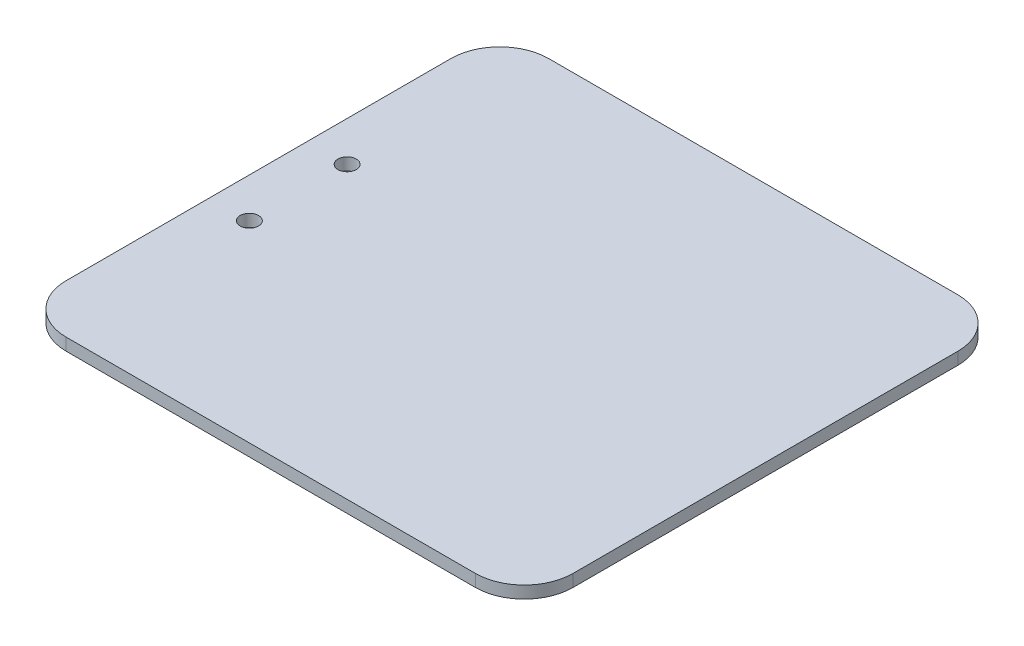
ISO-10303-21;
HEADER;
FILE_DESCRIPTION(('STEP AP214'),'2;1');
FILE_NAME('part.step','',(''),(''),'','','');
FILE_SCHEMA(('AUTOMOTIVE_DESIGN { 1 0 10303 214 1 1 1 1 }'));
ENDSEC;
DATA;
#1=APPLICATION_CONTEXT('core data for automotive mechanical design processes');
#2=APPLICATION_PROTOCOL_DEFINITION('international standard','automotive_design',2000,#1);
#3=PRODUCT_CONTEXT('',#1,'mechanical');
#4=PRODUCT('Part','Part','',(#3));
#5=PRODUCT_RELATED_PRODUCT_CATEGORY('part','',(#4));
#6=PRODUCT_DEFINITION_FORMATION('','',#4);
#7=PRODUCT_DEFINITION_CONTEXT('part definition',#1,'design');
#8=PRODUCT_DEFINITION('design','',#6,#7);
#9=PRODUCT_DEFINITION_SHAPE('','',#8);
#10=(LENGTH_UNIT() NAMED_UNIT(*) SI_UNIT(.MILLI.,.METRE.));
#11=(NAMED_UNIT(*) PLANE_ANGLE_UNIT() SI_UNIT($,.RADIAN.));
#12=(NAMED_UNIT(*) SI_UNIT($,.STERADIAN.) SOLID_ANGLE_UNIT());
#13=UNCERTAINTY_MEASURE_WITH_UNIT(LENGTH_MEASURE(1.E-05),#10,'distance_accuracy_value','');
#14=(GEOMETRIC_REPRESENTATION_CONTEXT(3) GLOBAL_UNCERTAINTY_ASSIGNED_CONTEXT((#13)) GLOBAL_UNIT_ASSIGNED_CONTEXT((#10,
#11,#12)) REPRESENTATION_CONTEXT('',''));
#15=CARTESIAN_POINT('',(0.,0.,0.));
#16=DIRECTION('',(0.,0.,1.));
#17=DIRECTION('',(1.,0.,0.));
#18=AXIS2_PLACEMENT_3D('',#15,#16,#17);
#19=CARTESIAN_POINT('',(8.,2.,-8.));
#20=DIRECTION('',(0.,-1.,0.));
#21=DIRECTION('',(0.,0.,-1.));
#22=AXIS2_PLACEMENT_3D('',#19,#20,#21);
#23=PLANE('',#22);
#24=CARTESIAN_POINT('',(8.,2.,-8.));
#25=DIRECTION('',(0.,1.,0.));
#26=DIRECTION('',(0.,0.,-1.));
#27=AXIS2_PLACEMENT_3D('',#24,#25,#26);
#28=CIRCLE('',#27,8.);
#29=CARTESIAN_POINT('',(0.,2.,-8.00000000000006));
#30=VERTEX_POINT('',#29);
#31=CARTESIAN_POINT('',(8.00000000000006,2.,0.));
#32=VERTEX_POINT('',#31);
#33=EDGE_CURVE('E170',#30,#32,#28,.T.);
#34=ORIENTED_EDGE('',*,*,#33,.T.);
#35=DIRECTION('',(1.,0.,0.));
#36=VECTOR('',#35,1.);
#37=CARTESIAN_POINT('',(8.00000000000006,2.,0.));
#38=LINE('',#37,#36);
#39=CARTESIAN_POINT('',(74.9999999999999,2.,0.));
#40=VERTEX_POINT('',#39);
#41=EDGE_CURVE('E106',#32,#40,#38,.T.);
#42=ORIENTED_EDGE('',*,*,#41,.T.);
#43=CARTESIAN_POINT('',(75.,2.,-8.));
#44=DIRECTION('',(0.,1.,0.));
#45=DIRECTION('',(0.,0.,1.));
#46=AXIS2_PLACEMENT_3D('',#43,#44,#45);
#47=CIRCLE('',#46,8.);
#48=CARTESIAN_POINT('',(83.,2.,-8.00000000000005));
#49=VERTEX_POINT('',#48);
#50=EDGE_CURVE('E191',#40,#49,#47,.T.);
#51=ORIENTED_EDGE('',*,*,#50,.T.);
#52=DIRECTION('',(0.,0.,-1.));
#53=VECTOR('',#52,1.);
#54=CARTESIAN_POINT('',(83.,2.,-8.00000000000006));
#55=LINE('',#54,#53);
#56=CARTESIAN_POINT('',(83.,2.,-71.));
#57=VERTEX_POINT('',#56);
#58=EDGE_CURVE('E205',#49,#57,#55,.T.);
#59=ORIENTED_EDGE('',*,*,#58,.T.);
#60=CARTESIAN_POINT('',(75.,2.,-71.));
#61=DIRECTION('',(0.,1.,0.));
#62=DIRECTION('',(0.,0.,-1.));
#63=AXIS2_PLACEMENT_3D('',#60,#61,#62);
#64=CIRCLE('',#63,7.99999999999999);
#65=CARTESIAN_POINT('',(74.9999999999999,2.,-79.));
#66=VERTEX_POINT('',#65);
#67=EDGE_CURVE('E125',#57,#66,#64,.T.);
#68=ORIENTED_EDGE('',*,*,#67,.T.);
#69=DIRECTION('',(-1.,0.,0.));
#70=VECTOR('',#69,1.);
#71=CARTESIAN_POINT('',(8.00000000000006,2.,-79.));
#72=LINE('',#71,#70);
#73=CARTESIAN_POINT('',(8.00000000000006,2.,-79.));
#74=VERTEX_POINT('',#73);
#75=EDGE_CURVE('E119',#66,#74,#72,.T.);
#76=ORIENTED_EDGE('',*,*,#75,.T.);
#77=CARTESIAN_POINT('',(8.,2.,-71.));
#78=DIRECTION('',(0.,1.,0.));
#79=DIRECTION('',(0.,0.,-1.));
#80=AXIS2_PLACEMENT_3D('',#77,#78,#79);
#81=CIRCLE('',#80,8.);
#82=CARTESIAN_POINT('',(0.,2.,-71.));
#83=VERTEX_POINT('',#82);
#84=EDGE_CURVE('E123',#74,#83,#81,.T.);
#85=ORIENTED_EDGE('',*,*,#84,.T.);
#86=DIRECTION('',(0.,0.,1.));
#87=VECTOR('',#86,1.);
#88=CARTESIAN_POINT('',(0.,2.,-8.00000000000006));
#89=LINE('',#88,#87);
#90=EDGE_CURVE('E63',#83,#30,#89,.T.);
#91=ORIENTED_EDGE('',*,*,#90,.T.);
#92=EDGE_LOOP('',(#34,#42,#51,#59,#68,#76,#85,#91));
#93=FACE_BOUND('',#92,.T.);
#94=CARTESIAN_POINT('',(6.5,2.,-47.5));
#95=DIRECTION('',(0.,1.,0.));
#96=DIRECTION('',(0.,0.,1.));
#97=AXIS2_PLACEMENT_3D('',#94,#95,#96);
#98=CIRCLE('',#97,1.5);
#99=CARTESIAN_POINT('',(6.5,2.,-46.));
#100=VERTEX_POINT('',#99);
#101=EDGE_CURVE('E152',#100,#100,#98,.T.);
#102=ORIENTED_EDGE('',*,*,#101,.F.);
#103=EDGE_LOOP('',(#102));
#104=FACE_BOUND('',#103,.T.);
#105=CARTESIAN_POINT('',(6.5,2.,-31.5));
#106=DIRECTION('',(0.,1.,0.));
#107=DIRECTION('',(0.,0.,-1.));
#108=AXIS2_PLACEMENT_3D('',#105,#106,#107);
#109=CIRCLE('',#108,1.5);
#110=CARTESIAN_POINT('',(6.5,2.,-33.));
#111=VERTEX_POINT('',#110);
#112=EDGE_CURVE('E219',#111,#111,#109,.T.);
#113=ORIENTED_EDGE('',*,*,#112,.F.);
#114=EDGE_LOOP('',(#113));
#115=FACE_BOUND('',#114,.T.);
#116=ADVANCED_FACE('F45',(#93,#104,#115),#23,.F.);
#117=CARTESIAN_POINT('',(8.,0.,-8.));
#118=DIRECTION('',(0.,-1.,0.));
#119=DIRECTION('',(0.,0.,-1.));
#120=AXIS2_PLACEMENT_3D('',#117,#118,#119);
#121=PLANE('',#120);
#122=CARTESIAN_POINT('',(6.5,0.,-47.5));
#123=DIRECTION('',(0.,1.,0.));
#124=DIRECTION('',(0.,0.,1.));
#125=AXIS2_PLACEMENT_3D('',#122,#123,#124);
#126=CIRCLE('',#125,1.5);
#127=CARTESIAN_POINT('',(6.5,0.,-46.));
#128=VERTEX_POINT('',#127);
#129=EDGE_CURVE('E215',#128,#128,#126,.T.);
#130=ORIENTED_EDGE('',*,*,#129,.T.);
#131=EDGE_LOOP('',(#130));
#132=FACE_BOUND('',#131,.T.);
#133=CARTESIAN_POINT('',(8.,0.,-8.));
#134=DIRECTION('',(0.,1.,0.));
#135=DIRECTION('',(0.,0.,-1.));
#136=AXIS2_PLACEMENT_3D('',#133,#134,#135);
#137=CIRCLE('',#136,8.);
#138=CARTESIAN_POINT('',(0.,0.,-8.00000000000006));
#139=VERTEX_POINT('',#138);
#140=CARTESIAN_POINT('',(8.00000000000006,0.,0.));
#141=VERTEX_POINT('',#140);
#142=EDGE_CURVE('E147',#139,#141,#137,.T.);
#143=ORIENTED_EDGE('',*,*,#142,.F.);
#144=DIRECTION('',(0.,0.,1.));
#145=VECTOR('',#144,1.);
#146=CARTESIAN_POINT('',(0.,0.,-8.00000000000006));
#147=LINE('',#146,#145);
#148=CARTESIAN_POINT('',(0.,0.,-71.));
#149=VERTEX_POINT('',#148);
#150=EDGE_CURVE('E98',#149,#139,#147,.T.);
#151=ORIENTED_EDGE('',*,*,#150,.F.);
#152=CARTESIAN_POINT('',(8.,0.,-71.));
#153=DIRECTION('',(0.,1.,0.));
#154=DIRECTION('',(0.,0.,-1.));
#155=AXIS2_PLACEMENT_3D('',#152,#153,#154);
#156=CIRCLE('',#155,8.);
#157=CARTESIAN_POINT('',(8.00000000000006,0.,-79.));
#158=VERTEX_POINT('',#157);
#159=EDGE_CURVE('E92',#158,#149,#156,.T.);
#160=ORIENTED_EDGE('',*,*,#159,.F.);
#161=DIRECTION('',(-1.,0.,0.));
#162=VECTOR('',#161,1.);
#163=CARTESIAN_POINT('',(8.00000000000006,0.,-79.));
#164=LINE('',#163,#162);
#165=CARTESIAN_POINT('',(74.9999999999999,0.,-79.));
#166=VERTEX_POINT('',#165);
#167=EDGE_CURVE('E134',#166,#158,#164,.T.);
#168=ORIENTED_EDGE('',*,*,#167,.F.);
#169=CARTESIAN_POINT('',(75.,0.,-71.));
#170=DIRECTION('',(0.,1.,0.));
#171=DIRECTION('',(0.,0.,-1.));
#172=AXIS2_PLACEMENT_3D('',#169,#170,#171);
#173=CIRCLE('',#172,7.99999999999999);
#174=CARTESIAN_POINT('',(83.,0.,-71.));
#175=VERTEX_POINT('',#174);
#176=EDGE_CURVE('E161',#175,#166,#173,.T.);
#177=ORIENTED_EDGE('',*,*,#176,.F.);
#178=DIRECTION('',(0.,0.,-1.));
#179=VECTOR('',#178,1.);
#180=CARTESIAN_POINT('',(83.,0.,-8.00000000000006));
#181=LINE('',#180,#179);
#182=CARTESIAN_POINT('',(83.,0.,-8.00000000000005));
#183=VERTEX_POINT('',#182);
#184=EDGE_CURVE('E158',#183,#175,#181,.T.);
#185=ORIENTED_EDGE('',*,*,#184,.F.);
#186=CARTESIAN_POINT('',(75.,0.,-8.));
#187=DIRECTION('',(0.,1.,0.));
#188=DIRECTION('',(0.,0.,1.));
#189=AXIS2_PLACEMENT_3D('',#186,#187,#188);
#190=CIRCLE('',#189,8.);
#191=CARTESIAN_POINT('',(74.9999999999999,0.,0.));
#192=VERTEX_POINT('',#191);
#193=EDGE_CURVE('E155',#192,#183,#190,.T.);
#194=ORIENTED_EDGE('',*,*,#193,.F.);
#195=DIRECTION('',(1.,0.,0.));
#196=VECTOR('',#195,1.);
#197=CARTESIAN_POINT('',(8.00000000000006,0.,0.));
#198=LINE('',#197,#196);
#199=EDGE_CURVE('E151',#141,#192,#198,.T.);
#200=ORIENTED_EDGE('',*,*,#199,.F.);
#201=EDGE_LOOP('',(#143,#151,#160,#168,#177,#185,#194,#200));
#202=FACE_BOUND('',#201,.T.);
#203=CARTESIAN_POINT('',(6.5,0.,-31.5));
#204=DIRECTION('',(0.,1.,0.));
#205=DIRECTION('',(0.,0.,-1.));
#206=AXIS2_PLACEMENT_3D('',#203,#204,#205);
#207=CIRCLE('',#206,1.5);
#208=CARTESIAN_POINT('',(6.5,0.,-33.));
#209=VERTEX_POINT('',#208);
#210=EDGE_CURVE('E223',#209,#209,#207,.T.);
#211=ORIENTED_EDGE('',*,*,#210,.T.);
#212=EDGE_LOOP('',(#211));
#213=FACE_BOUND('',#212,.T.);
#214=ADVANCED_FACE('F195',(#132,#202,#213),#121,.T.);
#215=CARTESIAN_POINT('',(8.,2.,-8.));
#216=DIRECTION('',(0.,-1.,0.));
#217=DIRECTION('',(0.,0.,-1.));
#218=AXIS2_PLACEMENT_3D('',#215,#216,#217);
#219=CYLINDRICAL_SURFACE('',#218,8.);
#220=ORIENTED_EDGE('',*,*,#142,.T.);
#221=DIRECTION('',(0.,-1.,0.));
#222=VECTOR('',#221,1.);
#223=CARTESIAN_POINT('',(8.00000000000006,2.,0.));
#224=LINE('',#223,#222);
#225=EDGE_CURVE('E11',#32,#141,#224,.T.);
#226=ORIENTED_EDGE('',*,*,#225,.F.);
#227=ORIENTED_EDGE('',*,*,#33,.F.);
#228=DIRECTION('',(0.,-1.,0.));
#229=VECTOR('',#228,1.);
#230=CARTESIAN_POINT('',(0.,2.,-8.00000000000006));
#231=LINE('',#230,#229);
#232=EDGE_CURVE('E143',#30,#139,#231,.T.);
#233=ORIENTED_EDGE('',*,*,#232,.T.);
#234=EDGE_LOOP('',(#220,#226,#227,#233));
#235=FACE_BOUND('',#234,.T.);
#236=ADVANCED_FACE('F47',(#235),#219,.T.);
#237=CARTESIAN_POINT('',(8.00000000000006,2.,0.));
#238=DIRECTION('',(0.,0.,-1.));
#239=DIRECTION('',(-1.,0.,0.));
#240=AXIS2_PLACEMENT_3D('',#237,#238,#239);
#241=PLANE('',#240);
#242=ORIENTED_EDGE('',*,*,#199,.T.);
#243=DIRECTION('',(0.,-1.,0.));
#244=VECTOR('',#243,1.);
#245=CARTESIAN_POINT('',(74.9999999999999,2.,0.));
#246=LINE('',#245,#244);
#247=EDGE_CURVE('E55',#40,#192,#246,.T.);
#248=ORIENTED_EDGE('',*,*,#247,.F.);
#249=ORIENTED_EDGE('',*,*,#41,.F.);
#250=ORIENTED_EDGE('',*,*,#225,.T.);
#251=EDGE_LOOP('',(#242,#248,#249,#250));
#252=FACE_BOUND('',#251,.T.);
#253=ADVANCED_FACE('F257',(#252),#241,.F.);
#254=CARTESIAN_POINT('',(75.,2.,-8.));
#255=DIRECTION('',(0.,-1.,0.));
#256=DIRECTION('',(0.,0.,-1.));
#257=AXIS2_PLACEMENT_3D('',#254,#255,#256);
#258=CYLINDRICAL_SURFACE('',#257,8.);
#259=ORIENTED_EDGE('',*,*,#193,.T.);
#260=DIRECTION('',(0.,-1.,0.));
#261=VECTOR('',#260,1.);
#262=CARTESIAN_POINT('',(83.,2.,-8.00000000000005));
#263=LINE('',#262,#261);
#264=EDGE_CURVE('E181',#49,#183,#263,.T.);
#265=ORIENTED_EDGE('',*,*,#264,.F.);
#266=ORIENTED_EDGE('',*,*,#50,.F.);
#267=ORIENTED_EDGE('',*,*,#247,.T.);
#268=EDGE_LOOP('',(#259,#265,#266,#267));
#269=FACE_BOUND('',#268,.T.);
#270=ADVANCED_FACE('F189',(#269),#258,.T.);
#271=CARTESIAN_POINT('',(83.,2.,-8.00000000000006));
#272=DIRECTION('',(-1.,0.,0.));
#273=DIRECTION('',(0.,0.,1.));
#274=AXIS2_PLACEMENT_3D('',#271,#272,#273);
#275=PLANE('',#274);
#276=ORIENTED_EDGE('',*,*,#184,.T.);
#277=DIRECTION('',(0.,-1.,0.));
#278=VECTOR('',#277,1.);
#279=CARTESIAN_POINT('',(83.,2.,-71.));
#280=LINE('',#279,#278);
#281=EDGE_CURVE('E177',#57,#175,#280,.T.);
#282=ORIENTED_EDGE('',*,*,#281,.F.);
#283=ORIENTED_EDGE('',*,*,#58,.F.);
#284=ORIENTED_EDGE('',*,*,#264,.T.);
#285=EDGE_LOOP('',(#276,#282,#283,#284));
#286=FACE_BOUND('',#285,.T.);
#287=ADVANCED_FACE('F200',(#286),#275,.F.);
#288=CARTESIAN_POINT('',(75.,2.,-71.));
#289=DIRECTION('',(0.,-1.,0.));
#290=DIRECTION('',(0.,0.,-1.));
#291=AXIS2_PLACEMENT_3D('',#288,#289,#290);
#292=CYLINDRICAL_SURFACE('',#291,7.99999999999999);
#293=ORIENTED_EDGE('',*,*,#176,.T.);
#294=DIRECTION('',(0.,-1.,0.));
#295=VECTOR('',#294,1.);
#296=CARTESIAN_POINT('',(74.9999999999999,2.,-79.));
#297=LINE('',#296,#295);
#298=EDGE_CURVE('E136',#66,#166,#297,.T.);
#299=ORIENTED_EDGE('',*,*,#298,.F.);
#300=ORIENTED_EDGE('',*,*,#67,.F.);
#301=ORIENTED_EDGE('',*,*,#281,.T.);
#302=EDGE_LOOP('',(#293,#299,#300,#301));
#303=FACE_BOUND('',#302,.T.);
#304=ADVANCED_FACE('F203',(#303),#292,.T.);
#305=CARTESIAN_POINT('',(8.00000000000006,2.,-79.));
#306=DIRECTION('',(0.,0.,1.));
#307=DIRECTION('',(1.,0.,0.));
#308=AXIS2_PLACEMENT_3D('',#305,#306,#307);
#309=PLANE('',#308);
#310=ORIENTED_EDGE('',*,*,#167,.T.);
#311=DIRECTION('',(0.,-1.,0.));
#312=VECTOR('',#311,1.);
#313=CARTESIAN_POINT('',(8.00000000000006,2.,-79.));
#314=LINE('',#313,#312);
#315=EDGE_CURVE('E131',#74,#158,#314,.T.);
#316=ORIENTED_EDGE('',*,*,#315,.F.);
#317=ORIENTED_EDGE('',*,*,#75,.F.);
#318=ORIENTED_EDGE('',*,*,#298,.T.);
#319=EDGE_LOOP('',(#310,#316,#317,#318));
#320=FACE_BOUND('',#319,.T.);
#321=ADVANCED_FACE('F132',(#320),#309,.F.);
#322=CARTESIAN_POINT('',(8.,2.,-71.));
#323=DIRECTION('',(0.,-1.,0.));
#324=DIRECTION('',(0.,0.,-1.));
#325=AXIS2_PLACEMENT_3D('',#322,#323,#324);
#326=CYLINDRICAL_SURFACE('',#325,8.);
#327=ORIENTED_EDGE('',*,*,#159,.T.);
#328=DIRECTION('',(0.,-1.,0.));
#329=VECTOR('',#328,1.);
#330=CARTESIAN_POINT('',(0.,2.,-71.));
#331=LINE('',#330,#329);
#332=EDGE_CURVE('E137',#83,#149,#331,.T.);
#333=ORIENTED_EDGE('',*,*,#332,.F.);
#334=ORIENTED_EDGE('',*,*,#84,.F.);
#335=ORIENTED_EDGE('',*,*,#315,.T.);
#336=EDGE_LOOP('',(#327,#333,#334,#335));
#337=FACE_BOUND('',#336,.T.);
#338=ADVANCED_FACE('F139',(#337),#326,.T.);
#339=CARTESIAN_POINT('',(0.,2.,-8.00000000000006));
#340=DIRECTION('',(1.,0.,0.));
#341=DIRECTION('',(0.,0.,-1.));
#342=AXIS2_PLACEMENT_3D('',#339,#340,#341);
#343=PLANE('',#342);
#344=ORIENTED_EDGE('',*,*,#150,.T.);
#345=ORIENTED_EDGE('',*,*,#232,.F.);
#346=ORIENTED_EDGE('',*,*,#90,.F.);
#347=ORIENTED_EDGE('',*,*,#332,.T.);
#348=EDGE_LOOP('',(#344,#345,#346,#347));
#349=FACE_BOUND('',#348,.T.);
#350=ADVANCED_FACE('F245',(#349),#343,.F.);
#351=CARTESIAN_POINT('',(6.5,2.,-47.5));
#352=DIRECTION('',(0.,-1.,0.));
#353=DIRECTION('',(0.,0.,-1.));
#354=AXIS2_PLACEMENT_3D('',#351,#352,#353);
#355=CYLINDRICAL_SURFACE('',#354,1.5);
#356=ORIENTED_EDGE('',*,*,#101,.T.);
#357=EDGE_LOOP('',(#356));
#358=FACE_BOUND('',#357,.T.);
#359=ORIENTED_EDGE('',*,*,#129,.F.);
#360=EDGE_LOOP('',(#359));
#361=FACE_BOUND('',#360,.T.);
#362=ADVANCED_FACE('F242',(#358,#361),#355,.F.);
#363=CARTESIAN_POINT('',(6.5,2.,-31.5));
#364=DIRECTION('',(0.,-1.,0.));
#365=DIRECTION('',(0.,0.,-1.));
#366=AXIS2_PLACEMENT_3D('',#363,#364,#365);
#367=CYLINDRICAL_SURFACE('',#366,1.5);
#368=ORIENTED_EDGE('',*,*,#112,.T.);
#369=EDGE_LOOP('',(#368));
#370=FACE_BOUND('',#369,.T.);
#371=ORIENTED_EDGE('',*,*,#210,.F.);
#372=EDGE_LOOP('',(#371));
#373=FACE_BOUND('',#372,.T.);
#374=ADVANCED_FACE('F231',(#370,#373),#367,.F.);
#375=CLOSED_SHELL('',(#116,#214,#236,#253,#270,#287,#304,#321,#338,#350,#362,#374));
#376=MANIFOLD_SOLID_BREP('B2',#375);
#377=ADVANCED_BREP_SHAPE_REPRESENTATION('',(#18,#376),#14);
#378=SHAPE_DEFINITION_REPRESENTATION(#9,#377);
ENDSEC;
END-ISO-10303-21;
